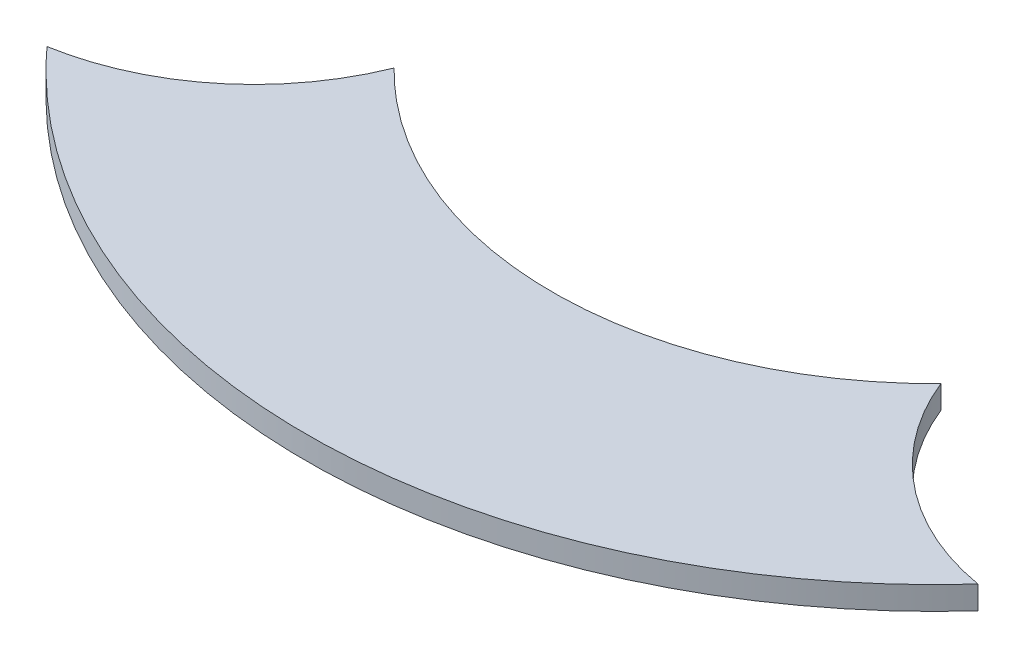
ISO-10303-21;
HEADER;
FILE_DESCRIPTION(('STEP AP214'),'2;1');
FILE_NAME('part.step','',(''),(''),'','','');
FILE_SCHEMA(('AUTOMOTIVE_DESIGN { 1 0 10303 214 1 1 1 1 }'));
ENDSEC;
DATA;
#1=APPLICATION_CONTEXT('core data for automotive mechanical design processes');
#2=APPLICATION_PROTOCOL_DEFINITION('international standard','automotive_design',2000,#1);
#3=PRODUCT_CONTEXT('',#1,'mechanical');
#4=PRODUCT('Part','Part','',(#3));
#5=PRODUCT_RELATED_PRODUCT_CATEGORY('part','',(#4));
#6=PRODUCT_DEFINITION_FORMATION('','',#4);
#7=PRODUCT_DEFINITION_CONTEXT('part definition',#1,'design');
#8=PRODUCT_DEFINITION('design','',#6,#7);
#9=PRODUCT_DEFINITION_SHAPE('','',#8);
#10=(LENGTH_UNIT() NAMED_UNIT(*) SI_UNIT(.MILLI.,.METRE.));
#11=(NAMED_UNIT(*) PLANE_ANGLE_UNIT() SI_UNIT($,.RADIAN.));
#12=(NAMED_UNIT(*) SI_UNIT($,.STERADIAN.) SOLID_ANGLE_UNIT());
#13=UNCERTAINTY_MEASURE_WITH_UNIT(LENGTH_MEASURE(1.E-05),#10,'distance_accuracy_value','');
#14=(GEOMETRIC_REPRESENTATION_CONTEXT(3) GLOBAL_UNCERTAINTY_ASSIGNED_CONTEXT((#13)) GLOBAL_UNIT_ASSIGNED_CONTEXT((#10,
#11,#12)) REPRESENTATION_CONTEXT('',''));
#15=CARTESIAN_POINT('',(0.,0.,0.));
#16=DIRECTION('',(0.,0.,1.));
#17=DIRECTION('',(1.,0.,0.));
#18=AXIS2_PLACEMENT_3D('',#15,#16,#17);
#19=CARTESIAN_POINT('',(-3.978997237075E-12,-53.85,1.090321272312E-12));
#20=DIRECTION('',(0.,-1.,0.));
#21=DIRECTION('',(0.,0.,-1.));
#22=AXIS2_PLACEMENT_3D('',#19,#20,#21);
#23=PLANE('',#22);
#24=CARTESIAN_POINT('',(58.2999999986202,-53.85,-83.336983202234));
#25=DIRECTION('',(0.,-1.,0.));
#26=DIRECTION('',(1.2631905395646E-05,0.,-0.999999999920218));
#27=AXIS2_PLACEMENT_3D('',#24,#25,#26);
#28=ELLIPSE('',#27,13.5418596422626,13.54185911672);
#29=CARTESIAN_POINT('',(48.2736226521442,-53.8499825229252,-74.2346133624979));
#30=VERTEX_POINT('',#29);
#31=CARTESIAN_POINT('',(68.3263777440571,-53.85,-74.234583912182));
#32=VERTEX_POINT('',#31);
#33=EDGE_CURVE('E71',#30,#32,#28,.F.);
#34=ORIENTED_EDGE('',*,*,#33,.F.);
#35=CARTESIAN_POINT('',(47.3496769119245,-53.85,-79.6140174672529));
#36=DIRECTION('',(0.,-1.,0.));
#37=DIRECTION('',(0.398742029726804,0.,0.917063135083593));
#38=AXIS2_PLACEMENT_3D('',#35,#36,#37);
#39=ELLIPSE('',#38,5.45816567108358,5.458165587009);
#40=CARTESIAN_POINT('',(52.4117389643796,-53.849999999893,-77.5726699175736));
#41=VERTEX_POINT('',#40);
#42=EDGE_CURVE('E68',#30,#41,#39,.F.);
#43=ORIENTED_EDGE('',*,*,#42,.T.);
#44=CARTESIAN_POINT('',(58.3000000000103,-53.85,-83.3369964395866));
#45=DIRECTION('',(0.,-1.,0.));
#46=DIRECTION('',(-5.73039614364216E-05,0.,-0.999999998358128));
#47=AXIS2_PLACEMENT_3D('',#44,#45,#46);
#48=ELLIPSE('',#47,8.24009313935586,8.240092813267);
#49=CARTESIAN_POINT('',(64.1882314574581,-53.85,-77.5726350261283));
#50=VERTEX_POINT('',#49);
#51=EDGE_CURVE('E59',#41,#50,#48,.F.);
#52=ORIENTED_EDGE('',*,*,#51,.T.);
#53=CARTESIAN_POINT('',(69.2503230934526,-53.85,-79.6140174739106));
#54=DIRECTION('',(0.,-1.,0.));
#55=DIRECTION('',(0.627854736318761,0.,-0.778330540376066));
#56=AXIS2_PLACEMENT_3D('',#53,#54,#55);
#57=ELLIPSE('',#56,5.45820618857835,5.458205892084);
#58=EDGE_CURVE('E53',#50,#32,#57,.F.);
#59=ORIENTED_EDGE('',*,*,#58,.T.);
#60=EDGE_LOOP('',(#34,#43,#52,#59));
#61=FACE_BOUND('',#60,.T.);
#62=ADVANCED_FACE('F17',(#61),#23,.T.);
#63=CARTESIAN_POINT('',(47.34965941523,-53.6,-79.61405770774));
#64=DIRECTION('',(6.99867769517866E-05,-0.999999984596551,0.000160961946072692));
#65=DIRECTION('',(0.,-0.0001609619464669,-0.999999987045626));
#66=AXIS2_PLACEMENT_3D('',#63,#64,#65);
#67=CYLINDRICAL_SURFACE('',#66,5.458165587009);
#68=CARTESIAN_POINT('',(47.3496419185355,-53.35,-79.6140979482271));
#69=DIRECTION('',(0.,-1.,0.));
#70=DIRECTION('',(0.398742029726804,0.,0.917063135083593));
#71=AXIS2_PLACEMENT_3D('',#68,#69,#70);
#72=ELLIPSE('',#71,5.45816567108358,5.458165587009);
#73=CARTESIAN_POINT('',(48.2736326034457,-53.35,-74.2347100968708));
#74=VERTEX_POINT('',#73);
#75=CARTESIAN_POINT('',(52.4117222802257,-53.3500414659914,-77.5727805654726));
#76=VERTEX_POINT('',#75);
#77=EDGE_CURVE('E76',#74,#76,#72,.F.);
#78=ORIENTED_EDGE('',*,*,#77,.T.);
#79=CARTESIAN_POINT('',(52.4117300316918,-53.3500414760981,-77.5728150102661));
#80=CARTESIAN_POINT('',(52.411731298098,-53.4333863306545,-77.5727902705464));
#81=CARTESIAN_POINT('',(52.4117325645043,-53.516731185211,-77.5727655308267));
#82=CARTESIAN_POINT('',(52.4117350973169,-53.6834208943238,-77.5727160513873));
#83=CARTESIAN_POINT('',(52.4117363637232,-53.7667657488803,-77.5726913116676));
#84=CARTESIAN_POINT('',(52.4117376301295,-53.8501106034367,-77.5726665719479));
#85=B_SPLINE_CURVE_WITH_KNOTS('',3,(#79,#80,#81,#82,#83,#84),.UNSPECIFIED.,.F.,.F.,(4,2,4),(0.,
0.25003457471361,0.500069149427227),.UNSPECIFIED.);
#86=EDGE_CURVE('E64',#76,#41,#85,.T.);
#87=ORIENTED_EDGE('',*,*,#86,.T.);
#88=ORIENTED_EDGE('',*,*,#42,.F.);
#89=CARTESIAN_POINT('',(48.2736326049905,-53.3499813769946,-74.2347101003576));
#90=CARTESIAN_POINT('',(48.2736256923016,-53.433314900978,-74.2346944977907));
#91=CARTESIAN_POINT('',(48.2736187796128,-53.5166484249614,-74.2346788952238));
#92=CARTESIAN_POINT('',(48.273604954235,-53.6833154729281,-74.23464769009));
#93=CARTESIAN_POINT('',(48.2735980415462,-53.7666489969115,-74.2346320875231));
#94=CARTESIAN_POINT('',(48.2735911288573,-53.8499825208949,-74.2346164849562));
#95=B_SPLINE_CURVE_WITH_KNOTS('',3,(#89,#90,#91,#92,#93,#94),.UNSPECIFIED.,.F.,.F.,(4,2,4),(0.,
0.250000577192171,0.500001154384335),.UNSPECIFIED.);
#96=EDGE_CURVE('E122',#74,#30,#95,.T.);
#97=ORIENTED_EDGE('',*,*,#96,.F.);
#98=EDGE_LOOP('',(#78,#87,#88,#97));
#99=FACE_BOUND('',#98,.T.);
#100=ADVANCED_FACE('F75',(#99),#67,.F.);
#101=CARTESIAN_POINT('',(58.29999999598,-53.6,-83.33706677223));
#102=DIRECTION('',(-1.61213557383793E-08,0.999999960426556,-0.000281330562631288));
#103=DIRECTION('',(0.,0.000281330562631288,0.999999960426556));
#104=AXIS2_PLACEMENT_3D('',#101,#102,#103);
#105=CYLINDRICAL_SURFACE('',#104,8.240092813267);
#106=CARTESIAN_POINT('',(58.2999999919497,-53.35,-83.3371371048734));
#107=DIRECTION('',(0.,-1.,0.));
#108=DIRECTION('',(-5.73039614364216E-05,0.,-0.999999998358128));
#109=AXIS2_PLACEMENT_3D('',#106,#107,#108);
#110=ELLIPSE('',#109,8.24009313935586,8.240092813267);
#111=CARTESIAN_POINT('',(64.1882798636637,-53.3500002397529,-77.5727430758103));
#112=VERTEX_POINT('',#111);
#113=EDGE_CURVE('E129',#76,#112,#110,.F.);
#114=ORIENTED_EDGE('',*,*,#113,.T.);
#115=CARTESIAN_POINT('',(64.1883012003653,-53.3500002867507,-77.5728469420451));
#116=CARTESIAN_POINT('',(64.1882895745149,-53.433348144259,-77.5728116165496));
#117=CARTESIAN_POINT('',(64.1882779486644,-53.5166960017674,-77.5727762910541));
#118=CARTESIAN_POINT('',(64.1882546969636,-53.683391716784,-77.5727056400631));
#119=CARTESIAN_POINT('',(64.1882430711131,-53.7667395742924,-77.5726703145676));
#120=CARTESIAN_POINT('',(64.1882314452627,-53.8500874318007,-77.5726349890721));
#121=B_SPLINE_CURVE_WITH_KNOTS('',3,(#115,#116,#117,#118,#119,#120),.UNSPECIFIED.,.F.,.F.,(4,2,
4),(0.,0.250043597415577,0.500087194831154),.UNSPECIFIED.);
#122=EDGE_CURVE('E66',#112,#50,#121,.T.);
#123=ORIENTED_EDGE('',*,*,#122,.T.);
#124=ORIENTED_EDGE('',*,*,#51,.F.);
#125=ORIENTED_EDGE('',*,*,#86,.F.);
#126=EDGE_LOOP('',(#114,#123,#124,#125));
#127=FACE_BOUND('',#126,.T.);
#128=ADVANCED_FACE('F62',(#127),#105,.F.);
#129=CARTESIAN_POINT('',(69.25037483,-53.6,-79.61408160998));
#130=DIRECTION('',(0.000206946178520191,0.999999945679159,-0.000256544263567689));
#131=DIRECTION('',(0.,0.000256544269061164,0.999999967092518));
#132=AXIS2_PLACEMENT_3D('',#129,#130,#131);
#133=CYLINDRICAL_SURFACE('',#132,5.458205892084);
#134=CARTESIAN_POINT('',(69.2504265665474,-53.35,-79.6141457460494));
#135=DIRECTION('',(0.,-1.,0.));
#136=DIRECTION('',(0.627854736318761,0.,-0.778330540376066));
#137=AXIS2_PLACEMENT_3D('',#134,#135,#136);
#138=ELLIPSE('',#137,5.45820618857835,5.458205892084);
#139=CARTESIAN_POINT('',(68.3263597504548,-53.3500000558944,-74.2347007839032));
#140=VERTEX_POINT('',#139);
#141=EDGE_CURVE('E26',#112,#140,#138,.F.);
#142=ORIENTED_EDGE('',*,*,#141,.T.);
#143=CARTESIAN_POINT('',(68.326376640746,-53.8499999922185,-74.2345809809516));
#144=CARTESIAN_POINT('',(68.3263775239675,-53.7666666707626,-74.2346051701008));
#145=CARTESIAN_POINT('',(68.3263784071889,-53.6833333493066,-74.23462935925));
#146=CARTESIAN_POINT('',(68.3263801736318,-53.5166667063947,-74.2346777375484));
#147=CARTESIAN_POINT('',(68.3263810568532,-53.4333333849388,-74.2347019266976));
#148=CARTESIAN_POINT('',(68.3263819400747,-53.3500000634828,-74.2347261158468));
#149=B_SPLINE_CURVE_WITH_KNOTS('',3,(#143,#144,#145,#146,#147,#148),.UNSPECIFIED.,.F.,.F.,(4,2,
4),(0.,0.249999974913969,0.499999949827938),.UNSPECIFIED.);
#150=EDGE_CURVE('E34',#32,#140,#149,.T.);
#151=ORIENTED_EDGE('',*,*,#150,.F.);
#152=ORIENTED_EDGE('',*,*,#58,.F.);
#153=ORIENTED_EDGE('',*,*,#122,.F.);
#154=EDGE_LOOP('',(#142,#151,#152,#153));
#155=FACE_BOUND('',#154,.T.);
#156=ADVANCED_FACE('F92',(#155),#133,.F.);
#157=CARTESIAN_POINT('',(58.2999999995,-53.6,-83.33705285203));
#158=DIRECTION('',(3.51923839740217E-09,0.99999996119125,-0.000278599173038014));
#159=DIRECTION('',(0.,0.000278599173038014,0.99999996119125));
#160=AXIS2_PLACEMENT_3D('',#157,#158,#159);
#161=CYLINDRICAL_SURFACE('',#160,13.54185911672);
#162=ORIENTED_EDGE('',*,*,#96,.T.);
#163=ORIENTED_EDGE('',*,*,#33,.T.);
#164=ORIENTED_EDGE('',*,*,#150,.T.);
#165=CARTESIAN_POINT('',(58.3000000003798,-53.35,-83.337122501826));
#166=DIRECTION('',(0.,-1.,0.));
#167=DIRECTION('',(1.2631905395646E-05,0.,-0.999999999920218));
#168=AXIS2_PLACEMENT_3D('',#165,#166,#167);
#169=ELLIPSE('',#168,13.5418596422626,13.54185911672);
#170=EDGE_CURVE('E11',#140,#74,#169,.T.);
#171=ORIENTED_EDGE('',*,*,#170,.T.);
#172=EDGE_LOOP('',(#162,#163,#164,#171));
#173=FACE_BOUND('',#172,.T.);
#174=ADVANCED_FACE('F110',(#173),#161,.T.);
#175=CARTESIAN_POINT('',(-3.978997237075E-12,-53.35,1.090321272312E-12));
#176=DIRECTION('',(0.,-1.,0.));
#177=DIRECTION('',(0.,0.,-1.));
#178=AXIS2_PLACEMENT_3D('',#175,#176,#177);
#179=PLANE('',#178);
#180=ORIENTED_EDGE('',*,*,#141,.F.);
#181=ORIENTED_EDGE('',*,*,#113,.F.);
#182=ORIENTED_EDGE('',*,*,#77,.F.);
#183=ORIENTED_EDGE('',*,*,#170,.F.);
#184=EDGE_LOOP('',(#180,#181,#182,#183));
#185=FACE_BOUND('',#184,.T.);
#186=ADVANCED_FACE('F114',(#185),#179,.F.);
#187=CLOSED_SHELL('',(#62,#100,#128,#156,#174,#186));
#188=MANIFOLD_SOLID_BREP('B1',#187);
#189=ADVANCED_BREP_SHAPE_REPRESENTATION('',(#18,#188),#14);
#190=SHAPE_DEFINITION_REPRESENTATION(#9,#189);
ENDSEC;
END-ISO-10303-21;
